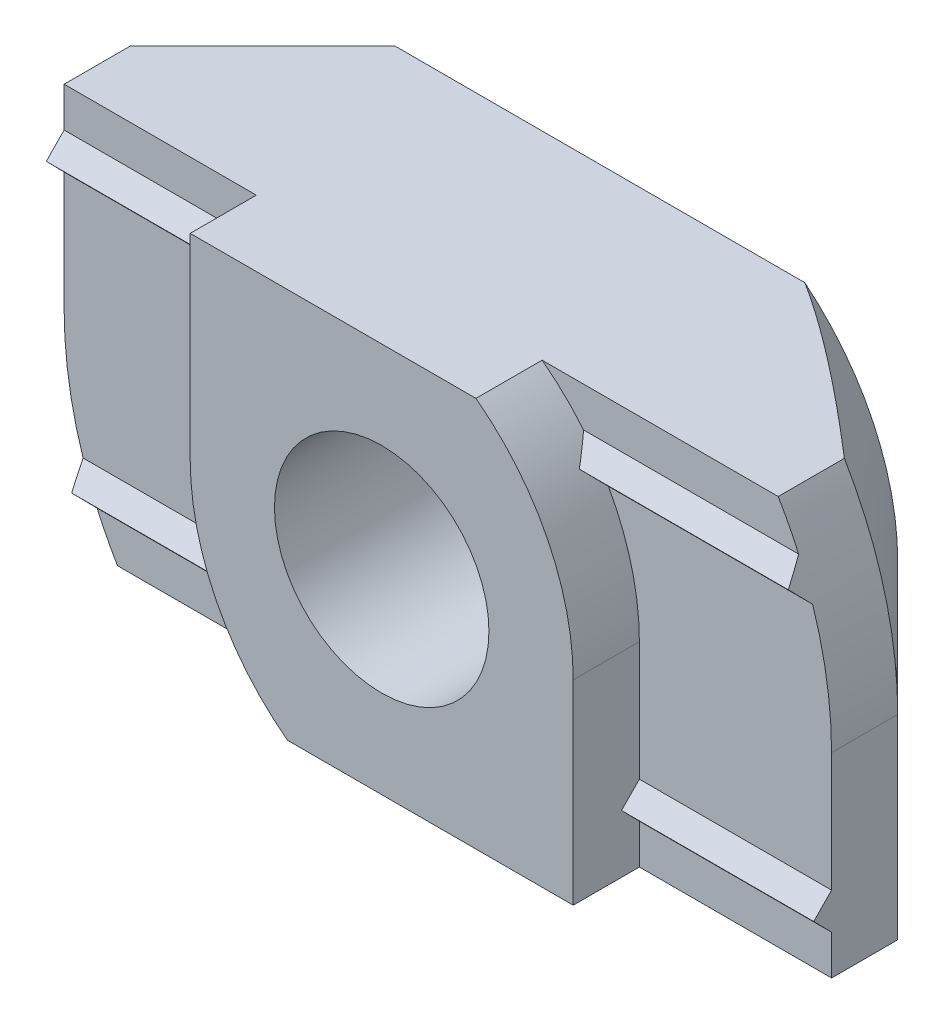
ISO-10303-21;
HEADER;
FILE_DESCRIPTION(('STEP AP214'),'2;1');
FILE_NAME('part.step','',(''),(''),'','','');
FILE_SCHEMA(('AUTOMOTIVE_DESIGN { 1 0 10303 214 1 1 1 1 }'));
ENDSEC;
DATA;
#1=APPLICATION_CONTEXT('core data for automotive mechanical design processes');
#2=APPLICATION_PROTOCOL_DEFINITION('international standard','automotive_design',2000,#1);
#3=PRODUCT_CONTEXT('',#1,'mechanical');
#4=PRODUCT('Part','Part','',(#3));
#5=PRODUCT_RELATED_PRODUCT_CATEGORY('part','',(#4));
#6=PRODUCT_DEFINITION_FORMATION('','',#4);
#7=PRODUCT_DEFINITION_CONTEXT('part definition',#1,'design');
#8=PRODUCT_DEFINITION('design','',#6,#7);
#9=PRODUCT_DEFINITION_SHAPE('','',#8);
#10=(LENGTH_UNIT() NAMED_UNIT(*) SI_UNIT(.MILLI.,.METRE.));
#11=(NAMED_UNIT(*) PLANE_ANGLE_UNIT() SI_UNIT($,.RADIAN.));
#12=(NAMED_UNIT(*) SI_UNIT($,.STERADIAN.) SOLID_ANGLE_UNIT());
#13=UNCERTAINTY_MEASURE_WITH_UNIT(LENGTH_MEASURE(1.E-05),#10,'distance_accuracy_value','');
#14=(GEOMETRIC_REPRESENTATION_CONTEXT(3) GLOBAL_UNCERTAINTY_ASSIGNED_CONTEXT((#13)) GLOBAL_UNIT_ASSIGNED_CONTEXT((#10,
#11,#12)) REPRESENTATION_CONTEXT('',''));
#15=CARTESIAN_POINT('',(0.,0.,0.));
#16=DIRECTION('',(0.,0.,1.));
#17=DIRECTION('',(1.,0.,0.));
#18=AXIS2_PLACEMENT_3D('',#15,#16,#17);
#19=CARTESIAN_POINT('',(0.,-2.35,3.));
#20=DIRECTION('',(0.,-0.700590079998202,0.713563970368539));
#21=DIRECTION('',(0.,-0.713563970368539,-0.700590079998202));
#22=AXIS2_PLACEMENT_3D('',#19,#20,#21);
#23=PLANE('',#22);
#24=DIRECTION('',(0.,-0.71356397036854,-0.7005900799982));
#25=VECTOR('',#24,1.);
#26=CARTESIAN_POINT('',(5.8,-2.075,3.27));
#27=LINE('',#26,#25);
#28=CARTESIAN_POINT('',(5.8,-2.075,3.27));
#29=VERTEX_POINT('',#28);
#30=CARTESIAN_POINT('',(5.8,-2.35,3.));
#31=VERTEX_POINT('',#30);
#32=EDGE_CURVE('E277',#29,#31,#27,.T.);
#33=ORIENTED_EDGE('',*,*,#32,.F.);
#34=DIRECTION('',(1.,0.,0.));
#35=VECTOR('',#34,1.);
#36=CARTESIAN_POINT('',(0.,-2.075,3.27));
#37=LINE('',#36,#35);
#38=CARTESIAN_POINT('',(2.895,-2.075,3.27));
#39=VERTEX_POINT('',#38);
#40=EDGE_CURVE('E264',#39,#29,#37,.T.);
#41=ORIENTED_EDGE('',*,*,#40,.F.);
#42=DIRECTION('',(0.,-0.713563970368539,-0.700590079998202));
#43=VECTOR('',#42,1.);
#44=CARTESIAN_POINT('',(2.895,-2.35,3.));
#45=LINE('',#44,#43);
#46=CARTESIAN_POINT('',(2.895,-2.35,3.));
#47=VERTEX_POINT('',#46);
#48=EDGE_CURVE('E205',#39,#47,#45,.T.);
#49=ORIENTED_EDGE('',*,*,#48,.T.);
#50=DIRECTION('',(1.,0.,0.));
#51=VECTOR('',#50,1.);
#52=CARTESIAN_POINT('',(0.,-2.35,3.));
#53=LINE('',#52,#51);
#54=EDGE_CURVE('E282',#31,#47,#53,.F.);
#55=ORIENTED_EDGE('',*,*,#54,.F.);
#56=EDGE_LOOP('',(#33,#41,#49,#55));
#57=FACE_BOUND('',#56,.T.);
#58=ADVANCED_FACE('F17',(#57),#23,.T.);
#59=CARTESIAN_POINT('',(0.,-2.35,3.));
#60=DIRECTION('',(0.,-0.700590079998202,0.713563970368539));
#61=DIRECTION('',(0.,-0.713563970368539,-0.700590079998202));
#62=AXIS2_PLACEMENT_3D('',#59,#60,#61);
#63=PLANE('',#62);
#64=CARTESIAN_POINT('',(0.8,0.,5.30727272727273));
#65=DIRECTION('',(0.,-0.700590079998202,0.713563970368539));
#66=DIRECTION('',(0.,-0.713563970368539,-0.700590079998202));
#67=AXIS2_PLACEMENT_3D('',#64,#65,#66);
#68=ELLIPSE('',#67,5.17823230073068,3.695);
#69=CARTESIAN_POINT('',(-2.05140754715982,-2.35,3.));
#70=VERTEX_POINT('',#69);
#71=CARTESIAN_POINT('',(-2.25735179526335,-2.075,3.27));
#72=VERTEX_POINT('',#71);
#73=EDGE_CURVE('E20',#70,#72,#68,.F.);
#74=ORIENTED_EDGE('',*,*,#73,.T.);
#75=DIRECTION('',(1.,0.,0.));
#76=VECTOR('',#75,1.);
#77=CARTESIAN_POINT('',(0.,-2.075,3.27));
#78=LINE('',#77,#76);
#79=CARTESIAN_POINT('',(-5.41612176746424,-2.075,3.27));
#80=VERTEX_POINT('',#79);
#81=EDGE_CURVE('E257',#80,#72,#78,.T.);
#82=ORIENTED_EDGE('',*,*,#81,.F.);
#83=CARTESIAN_POINT('',(0.,0.,5.30727272727273));
#84=DIRECTION('',(0.,-0.700590079998202,0.713563970368539));
#85=DIRECTION('',(0.,0.713563970368539,0.700590079998202));
#86=AXIS2_PLACEMENT_3D('',#83,#84,#85);
#87=ELLIPSE('',#86,8.12821308369092,5.8);
#88=CARTESIAN_POINT('',(-5.30259370497118,-2.35,3.));
#89=VERTEX_POINT('',#88);
#90=EDGE_CURVE('E209',#89,#80,#87,.F.);
#91=ORIENTED_EDGE('',*,*,#90,.F.);
#92=DIRECTION('',(1.,0.,0.));
#93=VECTOR('',#92,1.);
#94=CARTESIAN_POINT('',(0.,-2.35,3.));
#95=LINE('',#94,#93);
#96=EDGE_CURVE('E207',#70,#89,#95,.F.);
#97=ORIENTED_EDGE('',*,*,#96,.F.);
#98=EDGE_LOOP('',(#74,#82,#91,#97));
#99=FACE_BOUND('',#98,.T.);
#100=ADVANCED_FACE('F208',(#99),#63,.T.);
#101=CARTESIAN_POINT('',(0.,2.075,3.27));
#102=DIRECTION('',(0.,0.700590079998202,-0.713563970368539));
#103=DIRECTION('',(0.,0.713563970368539,0.700590079998202));
#104=AXIS2_PLACEMENT_3D('',#101,#102,#103);
#105=PLANE('',#104);
#106=DIRECTION('',(1.,0.,0.));
#107=VECTOR('',#106,1.);
#108=CARTESIAN_POINT('',(0.,2.075,3.27));
#109=LINE('',#108,#107);
#110=CARTESIAN_POINT('',(5.41612176746424,2.075,3.27));
#111=VERTEX_POINT('',#110);
#112=CARTESIAN_POINT('',(2.25735179526335,2.075,3.27));
#113=VERTEX_POINT('',#112);
#114=EDGE_CURVE('E259',#111,#113,#109,.F.);
#115=ORIENTED_EDGE('',*,*,#114,.T.);
#116=CARTESIAN_POINT('',(-0.8,0.,1.23272727272727));
#117=DIRECTION('',(0.,0.700590079998202,-0.713563970368539));
#118=DIRECTION('',(0.,-0.713563970368539,-0.700590079998202));
#119=AXIS2_PLACEMENT_3D('',#116,#117,#118);
#120=ELLIPSE('',#119,5.17823230073068,3.695);
#121=CARTESIAN_POINT('',(2.42692190794881,1.8,3.));
#122=VERTEX_POINT('',#121);
#123=EDGE_CURVE('E204',#122,#113,#120,.F.);
#124=ORIENTED_EDGE('',*,*,#123,.F.);
#125=DIRECTION('',(1.,0.,0.));
#126=VECTOR('',#125,1.);
#127=CARTESIAN_POINT('',(0.,1.8,3.));
#128=LINE('',#127,#126);
#129=CARTESIAN_POINT('',(5.51361950083609,1.8,3.));
#130=VERTEX_POINT('',#129);
#131=EDGE_CURVE('E240',#130,#122,#128,.F.);
#132=ORIENTED_EDGE('',*,*,#131,.F.);
#133=CARTESIAN_POINT('',(0.,0.,1.23272727272727));
#134=DIRECTION('',(0.,0.700590079998202,-0.713563970368539));
#135=DIRECTION('',(0.,0.713563970368539,0.700590079998202));
#136=AXIS2_PLACEMENT_3D('',#133,#134,#135);
#137=ELLIPSE('',#136,8.12821308369092,5.8);
#138=EDGE_CURVE('E243',#111,#130,#137,.T.);
#139=ORIENTED_EDGE('',*,*,#138,.F.);
#140=EDGE_LOOP('',(#115,#124,#132,#139));
#141=FACE_BOUND('',#140,.T.);
#142=ADVANCED_FACE('F593',(#141),#105,.F.);
#143=CARTESIAN_POINT('',(0.,-2.075,3.27));
#144=DIRECTION('',(0.,0.700590079998202,0.713563970368539));
#145=DIRECTION('',(0.,-0.713563970368539,0.700590079998202));
#146=AXIS2_PLACEMENT_3D('',#143,#144,#145);
#147=PLANE('',#146);
#148=DIRECTION('',(0.,-0.713563970368538,0.700590079998203));
#149=VECTOR('',#148,1.);
#150=CARTESIAN_POINT('',(5.8,-1.8,3.));
#151=LINE('',#150,#149);
#152=CARTESIAN_POINT('',(5.8,-1.8,3.));
#153=VERTEX_POINT('',#152);
#154=EDGE_CURVE('E252',#153,#29,#151,.T.);
#155=ORIENTED_EDGE('',*,*,#154,.F.);
#156=DIRECTION('',(1.,0.,0.));
#157=VECTOR('',#156,1.);
#158=CARTESIAN_POINT('',(0.,-1.8,3.));
#159=LINE('',#158,#157);
#160=CARTESIAN_POINT('',(2.895,-1.8,3.));
#161=VERTEX_POINT('',#160);
#162=EDGE_CURVE('E480',#161,#153,#159,.T.);
#163=ORIENTED_EDGE('',*,*,#162,.F.);
#164=DIRECTION('',(0.,-0.713563970368539,0.700590079998202));
#165=VECTOR('',#164,1.);
#166=CARTESIAN_POINT('',(2.895,-2.075,3.27));
#167=LINE('',#166,#165);
#168=EDGE_CURVE('E260',#161,#39,#167,.T.);
#169=ORIENTED_EDGE('',*,*,#168,.T.);
#170=ORIENTED_EDGE('',*,*,#40,.T.);
#171=EDGE_LOOP('',(#155,#163,#169,#170));
#172=FACE_BOUND('',#171,.T.);
#173=ADVANCED_FACE('F590',(#172),#147,.T.);
#174=CARTESIAN_POINT('',(0.,2.35,3.));
#175=DIRECTION('',(0.,-0.700590079998202,-0.713563970368539));
#176=DIRECTION('',(0.,0.713563970368539,-0.700590079998202));
#177=AXIS2_PLACEMENT_3D('',#174,#175,#176);
#178=PLANE('',#177);
#179=DIRECTION('',(1.,0.,0.));
#180=VECTOR('',#179,1.);
#181=CARTESIAN_POINT('',(0.,2.35,3.));
#182=LINE('',#181,#180);
#183=CARTESIAN_POINT('',(-5.8,2.35,3.));
#184=VERTEX_POINT('',#183);
#185=CARTESIAN_POINT('',(-2.895,2.35,3.));
#186=VERTEX_POINT('',#185);
#187=EDGE_CURVE('E462',#184,#186,#182,.T.);
#188=ORIENTED_EDGE('',*,*,#187,.F.);
#189=DIRECTION('',(0.,0.71356397036854,-0.7005900799982));
#190=VECTOR('',#189,1.);
#191=CARTESIAN_POINT('',(-5.8,2.075,3.27));
#192=LINE('',#191,#190);
#193=CARTESIAN_POINT('',(-5.8,2.075,3.27));
#194=VERTEX_POINT('',#193);
#195=EDGE_CURVE('E525',#194,#184,#192,.T.);
#196=ORIENTED_EDGE('',*,*,#195,.F.);
#197=DIRECTION('',(1.,0.,0.));
#198=VECTOR('',#197,1.);
#199=CARTESIAN_POINT('',(0.,2.075,3.27));
#200=LINE('',#199,#198);
#201=CARTESIAN_POINT('',(-2.895,2.075,3.27));
#202=VERTEX_POINT('',#201);
#203=EDGE_CURVE('E256',#194,#202,#200,.T.);
#204=ORIENTED_EDGE('',*,*,#203,.T.);
#205=DIRECTION('',(0.,0.713563970368539,-0.700590079998202));
#206=VECTOR('',#205,1.);
#207=CARTESIAN_POINT('',(-2.895,2.35,3.));
#208=LINE('',#207,#206);
#209=EDGE_CURVE('E269',#186,#202,#208,.F.);
#210=ORIENTED_EDGE('',*,*,#209,.F.);
#211=EDGE_LOOP('',(#188,#196,#204,#210));
#212=FACE_BOUND('',#211,.T.);
#213=ADVANCED_FACE('F592',(#212),#178,.F.);
#214=CARTESIAN_POINT('',(0.,2.35,3.));
#215=DIRECTION('',(0.,-0.700590079998202,-0.713563970368539));
#216=DIRECTION('',(0.,0.713563970368539,-0.700590079998202));
#217=AXIS2_PLACEMENT_3D('',#214,#215,#216);
#218=PLANE('',#217);
#219=DIRECTION('',(1.,0.,0.));
#220=VECTOR('',#219,1.);
#221=CARTESIAN_POINT('',(0.,2.35,3.));
#222=LINE('',#221,#220);
#223=CARTESIAN_POINT('',(2.05140754715982,2.35,3.));
#224=VERTEX_POINT('',#223);
#225=CARTESIAN_POINT('',(5.30259370497118,2.35,3.));
#226=VERTEX_POINT('',#225);
#227=EDGE_CURVE('E233',#224,#226,#222,.T.);
#228=ORIENTED_EDGE('',*,*,#227,.F.);
#229=CARTESIAN_POINT('',(-0.8,0.,5.30727272727273));
#230=DIRECTION('',(0.,-0.700590079998202,-0.713563970368539));
#231=DIRECTION('',(0.,0.713563970368539,-0.700590079998202));
#232=AXIS2_PLACEMENT_3D('',#229,#230,#231);
#233=ELLIPSE('',#232,5.17823230073068,3.695);
#234=EDGE_CURVE('E258',#113,#224,#233,.F.);
#235=ORIENTED_EDGE('',*,*,#234,.F.);
#236=ORIENTED_EDGE('',*,*,#114,.F.);
#237=CARTESIAN_POINT('',(0.,0.,5.30727272727273));
#238=DIRECTION('',(0.,-0.700590079998202,-0.713563970368539));
#239=DIRECTION('',(0.,-0.713563970368539,0.700590079998202));
#240=AXIS2_PLACEMENT_3D('',#237,#238,#239);
#241=ELLIPSE('',#240,8.12821308369092,5.8);
#242=EDGE_CURVE('E246',#226,#111,#241,.T.);
#243=ORIENTED_EDGE('',*,*,#242,.F.);
#244=EDGE_LOOP('',(#228,#235,#236,#243));
#245=FACE_BOUND('',#244,.T.);
#246=ADVANCED_FACE('F599',(#245),#218,.F.);
#247=CARTESIAN_POINT('',(0.,-2.075,3.27));
#248=DIRECTION('',(0.,0.700590079998202,0.713563970368539));
#249=DIRECTION('',(0.,-0.713563970368539,0.700590079998202));
#250=AXIS2_PLACEMENT_3D('',#247,#248,#249);
#251=PLANE('',#250);
#252=CARTESIAN_POINT('',(0.8,0.,1.23272727272727));
#253=DIRECTION('',(0.,0.700590079998202,0.713563970368539));
#254=DIRECTION('',(0.,0.713563970368539,-0.700590079998202));
#255=AXIS2_PLACEMENT_3D('',#252,#253,#254);
#256=ELLIPSE('',#255,5.17823230073068,3.695);
#257=CARTESIAN_POINT('',(-2.42692190794881,-1.8,3.));
#258=VERTEX_POINT('',#257);
#259=EDGE_CURVE('E200',#72,#258,#256,.F.);
#260=ORIENTED_EDGE('',*,*,#259,.T.);
#261=DIRECTION('',(1.,0.,0.));
#262=VECTOR('',#261,1.);
#263=CARTESIAN_POINT('',(0.,-1.8,3.));
#264=LINE('',#263,#262);
#265=CARTESIAN_POINT('',(-5.51361950083609,-1.8,3.));
#266=VERTEX_POINT('',#265);
#267=EDGE_CURVE('E232',#266,#258,#264,.T.);
#268=ORIENTED_EDGE('',*,*,#267,.F.);
#269=CARTESIAN_POINT('',(0.,0.,1.23272727272727));
#270=DIRECTION('',(0.,0.700590079998202,0.713563970368539));
#271=DIRECTION('',(0.,-0.713563970368539,0.700590079998202));
#272=AXIS2_PLACEMENT_3D('',#269,#270,#271);
#273=ELLIPSE('',#272,8.12821308369092,5.8);
#274=EDGE_CURVE('E250',#80,#266,#273,.F.);
#275=ORIENTED_EDGE('',*,*,#274,.F.);
#276=ORIENTED_EDGE('',*,*,#81,.T.);
#277=EDGE_LOOP('',(#260,#268,#275,#276));
#278=FACE_BOUND('',#277,.T.);
#279=ADVANCED_FACE('F645',(#278),#251,.T.);
#280=CARTESIAN_POINT('',(0.,2.075,3.27));
#281=DIRECTION('',(0.,0.700590079998202,-0.713563970368539));
#282=DIRECTION('',(0.,0.713563970368539,0.700590079998202));
#283=AXIS2_PLACEMENT_3D('',#280,#281,#282);
#284=PLANE('',#283);
#285=ORIENTED_EDGE('',*,*,#203,.F.);
#286=DIRECTION('',(0.,0.713563970368538,0.700590079998203));
#287=VECTOR('',#286,1.);
#288=CARTESIAN_POINT('',(-5.8,1.8,3.));
#289=LINE('',#288,#287);
#290=CARTESIAN_POINT('',(-5.8,1.8,3.));
#291=VERTEX_POINT('',#290);
#292=EDGE_CURVE('E528',#291,#194,#289,.T.);
#293=ORIENTED_EDGE('',*,*,#292,.F.);
#294=DIRECTION('',(1.,0.,0.));
#295=VECTOR('',#294,1.);
#296=CARTESIAN_POINT('',(0.,1.8,3.));
#297=LINE('',#296,#295);
#298=CARTESIAN_POINT('',(-2.895,1.8,3.));
#299=VERTEX_POINT('',#298);
#300=EDGE_CURVE('E449',#299,#291,#297,.F.);
#301=ORIENTED_EDGE('',*,*,#300,.F.);
#302=DIRECTION('',(0.,0.713563970368539,0.700590079998202));
#303=VECTOR('',#302,1.);
#304=CARTESIAN_POINT('',(-2.895,2.075,3.27));
#305=LINE('',#304,#303);
#306=EDGE_CURVE('E295',#202,#299,#305,.F.);
#307=ORIENTED_EDGE('',*,*,#306,.F.);
#308=EDGE_LOOP('',(#285,#293,#301,#307));
#309=FACE_BOUND('',#308,.T.);
#310=ADVANCED_FACE('F654',(#309),#284,.F.);
#311=CARTESIAN_POINT('',(-5.8,-2.95,0.));
#312=DIRECTION('',(-1.,0.,0.));
#313=DIRECTION('',(0.,0.,1.));
#314=AXIS2_PLACEMENT_3D('',#311,#312,#313);
#315=PLANE('',#314);
#316=DIRECTION('',(0.,0.,1.));
#317=VECTOR('',#316,1.);
#318=CARTESIAN_POINT('',(-5.8,2.95,0.));
#319=LINE('',#318,#317);
#320=CARTESIAN_POINT('',(-5.8,2.95,3.));
#321=VERTEX_POINT('',#320);
#322=CARTESIAN_POINT('',(-5.8,2.95,2.));
#323=VERTEX_POINT('',#322);
#324=EDGE_CURVE('E521',#321,#323,#319,.F.);
#325=ORIENTED_EDGE('',*,*,#324,.T.);
#326=DIRECTION('',(0.,1.,0.));
#327=VECTOR('',#326,1.);
#328=CARTESIAN_POINT('',(-5.8,-1.475,2.));
#329=LINE('',#328,#327);
#330=CARTESIAN_POINT('',(-5.79999999998258,0.,1.99999999997635));
#331=VERTEX_POINT('',#330);
#332=EDGE_CURVE('E448',#331,#323,#329,.T.);
#333=ORIENTED_EDGE('',*,*,#332,.F.);
#334=DIRECTION('',(0.,0.,1.));
#335=VECTOR('',#334,1.);
#336=CARTESIAN_POINT('',(-5.8,0.,2.5));
#337=LINE('',#336,#335);
#338=CARTESIAN_POINT('',(-5.8,0.,3.));
#339=VERTEX_POINT('',#338);
#340=EDGE_CURVE('E519',#339,#331,#337,.F.);
#341=ORIENTED_EDGE('',*,*,#340,.F.);
#342=DIRECTION('',(0.,1.,0.));
#343=VECTOR('',#342,1.);
#344=CARTESIAN_POINT('',(-5.8,0.,3.));
#345=LINE('',#344,#343);
#346=EDGE_CURVE('E445',#291,#339,#345,.F.);
#347=ORIENTED_EDGE('',*,*,#346,.F.);
#348=ORIENTED_EDGE('',*,*,#292,.T.);
#349=ORIENTED_EDGE('',*,*,#195,.T.);
#350=DIRECTION('',(0.,1.,0.));
#351=VECTOR('',#350,1.);
#352=CARTESIAN_POINT('',(-5.8,0.,3.));
#353=LINE('',#352,#351);
#354=EDGE_CURVE('E237',#321,#184,#353,.F.);
#355=ORIENTED_EDGE('',*,*,#354,.F.);
#356=EDGE_LOOP('',(#325,#333,#341,#347,#348,#349,#355));
#357=FACE_BOUND('',#356,.T.);
#358=ADVANCED_FACE('F664',(#357),#315,.T.);
#359=CARTESIAN_POINT('',(0.,0.,2.5));
#360=DIRECTION('',(0.,0.,1.));
#361=DIRECTION('',(1.,0.,0.));
#362=AXIS2_PLACEMENT_3D('',#359,#360,#361);
#363=CYLINDRICAL_SURFACE('',#362,5.8);
#364=ORIENTED_EDGE('',*,*,#90,.T.);
#365=ORIENTED_EDGE('',*,*,#274,.T.);
#366=CARTESIAN_POINT('',(0.,0.,3.));
#367=DIRECTION('',(0.,0.,1.));
#368=DIRECTION('',(1.,0.,0.));
#369=AXIS2_PLACEMENT_3D('',#366,#367,#368);
#370=CIRCLE('',#369,5.8);
#371=EDGE_CURVE('E229',#339,#266,#370,.T.);
#372=ORIENTED_EDGE('',*,*,#371,.F.);
#373=ORIENTED_EDGE('',*,*,#340,.T.);
#374=CARTESIAN_POINT('',(0.,0.,1.99999999995271));
#375=DIRECTION('',(0.,0.,1.));
#376=DIRECTION('',(-1.,0.,0.));
#377=AXIS2_PLACEMENT_3D('',#374,#375,#376);
#378=CIRCLE('',#377,5.79999999996517);
#379=CARTESIAN_POINT('',(-4.99374608883931,-2.95,1.99999999997012));
#380=VERTEX_POINT('',#379);
#381=EDGE_CURVE('E432',#380,#331,#378,.F.);
#382=ORIENTED_EDGE('',*,*,#381,.F.);
#383=DIRECTION('',(0.,0.,1.));
#384=VECTOR('',#383,1.);
#385=CARTESIAN_POINT('',(-4.99374608885954,-2.95,2.5));
#386=LINE('',#385,#384);
#387=CARTESIAN_POINT('',(-4.99374608885954,-2.95,3.));
#388=VERTEX_POINT('',#387);
#389=EDGE_CURVE('E254',#380,#388,#386,.T.);
#390=ORIENTED_EDGE('',*,*,#389,.T.);
#391=CARTESIAN_POINT('',(0.,0.,3.));
#392=DIRECTION('',(0.,0.,1.));
#393=DIRECTION('',(1.,0.,0.));
#394=AXIS2_PLACEMENT_3D('',#391,#392,#393);
#395=CIRCLE('',#394,5.8);
#396=EDGE_CURVE('E214',#89,#388,#395,.T.);
#397=ORIENTED_EDGE('',*,*,#396,.F.);
#398=EDGE_LOOP('',(#364,#365,#372,#373,#382,#390,#397));
#399=FACE_BOUND('',#398,.T.);
#400=ADVANCED_FACE('F674',(#399),#363,.T.);
#401=CARTESIAN_POINT('',(5.8,2.95,0.));
#402=DIRECTION('',(1.,0.,0.));
#403=DIRECTION('',(0.,0.,-1.));
#404=AXIS2_PLACEMENT_3D('',#401,#402,#403);
#405=PLANE('',#404);
#406=DIRECTION('',(0.,0.,-1.));
#407=VECTOR('',#406,1.);
#408=CARTESIAN_POINT('',(5.8,-2.95,0.));
#409=LINE('',#408,#407);
#410=CARTESIAN_POINT('',(5.8,-2.95,3.));
#411=VERTEX_POINT('',#410);
#412=CARTESIAN_POINT('',(5.8,-2.95,2.));
#413=VERTEX_POINT('',#412);
#414=EDGE_CURVE('E279',#411,#413,#409,.T.);
#415=ORIENTED_EDGE('',*,*,#414,.T.);
#416=DIRECTION('',(0.,1.,0.));
#417=VECTOR('',#416,1.);
#418=CARTESIAN_POINT('',(5.8,1.475,2.));
#419=LINE('',#418,#417);
#420=CARTESIAN_POINT('',(5.79999999998258,0.,1.99999999997635));
#421=VERTEX_POINT('',#420);
#422=EDGE_CURVE('E431',#421,#413,#419,.F.);
#423=ORIENTED_EDGE('',*,*,#422,.F.);
#424=DIRECTION('',(0.,0.,1.));
#425=VECTOR('',#424,1.);
#426=CARTESIAN_POINT('',(5.8,0.,2.5));
#427=LINE('',#426,#425);
#428=CARTESIAN_POINT('',(5.8,0.,3.));
#429=VERTEX_POINT('',#428);
#430=EDGE_CURVE('E245',#429,#421,#427,.F.);
#431=ORIENTED_EDGE('',*,*,#430,.F.);
#432=DIRECTION('',(0.,1.,0.));
#433=VECTOR('',#432,1.);
#434=CARTESIAN_POINT('',(5.8,0.,3.));
#435=LINE('',#434,#433);
#436=EDGE_CURVE('E477',#153,#429,#435,.T.);
#437=ORIENTED_EDGE('',*,*,#436,.F.);
#438=ORIENTED_EDGE('',*,*,#154,.T.);
#439=ORIENTED_EDGE('',*,*,#32,.T.);
#440=DIRECTION('',(0.,1.,0.));
#441=VECTOR('',#440,1.);
#442=CARTESIAN_POINT('',(5.8,0.,3.));
#443=LINE('',#442,#441);
#444=EDGE_CURVE('E242',#411,#31,#443,.T.);
#445=ORIENTED_EDGE('',*,*,#444,.F.);
#446=EDGE_LOOP('',(#415,#423,#431,#437,#438,#439,#445));
#447=FACE_BOUND('',#446,.T.);
#448=ADVANCED_FACE('F553',(#447),#405,.T.);
#449=CARTESIAN_POINT('',(0.,0.,2.5));
#450=DIRECTION('',(0.,0.,1.));
#451=DIRECTION('',(1.,0.,0.));
#452=AXIS2_PLACEMENT_3D('',#449,#450,#451);
#453=CYLINDRICAL_SURFACE('',#452,5.8);
#454=ORIENTED_EDGE('',*,*,#430,.T.);
#455=CARTESIAN_POINT('',(0.,0.,1.99999999995271));
#456=DIRECTION('',(0.,0.,1.));
#457=DIRECTION('',(1.,0.,0.));
#458=AXIS2_PLACEMENT_3D('',#455,#456,#457);
#459=CIRCLE('',#458,5.79999999996517);
#460=CARTESIAN_POINT('',(4.99374608883931,2.95,1.99999999997012));
#461=VERTEX_POINT('',#460);
#462=EDGE_CURVE('E225',#461,#421,#459,.F.);
#463=ORIENTED_EDGE('',*,*,#462,.F.);
#464=DIRECTION('',(0.,0.,1.));
#465=VECTOR('',#464,1.);
#466=CARTESIAN_POINT('',(4.99374608885954,2.95,2.5));
#467=LINE('',#466,#465);
#468=CARTESIAN_POINT('',(4.99374608885954,2.95,3.));
#469=VERTEX_POINT('',#468);
#470=EDGE_CURVE('E249',#461,#469,#467,.T.);
#471=ORIENTED_EDGE('',*,*,#470,.T.);
#472=CARTESIAN_POINT('',(0.,0.,3.));
#473=DIRECTION('',(0.,0.,1.));
#474=DIRECTION('',(1.,0.,0.));
#475=AXIS2_PLACEMENT_3D('',#472,#473,#474);
#476=CIRCLE('',#475,5.8);
#477=EDGE_CURVE('E234',#226,#469,#476,.T.);
#478=ORIENTED_EDGE('',*,*,#477,.F.);
#479=ORIENTED_EDGE('',*,*,#242,.T.);
#480=ORIENTED_EDGE('',*,*,#138,.T.);
#481=CARTESIAN_POINT('',(0.,0.,3.));
#482=DIRECTION('',(0.,0.,1.));
#483=DIRECTION('',(1.,0.,0.));
#484=AXIS2_PLACEMENT_3D('',#481,#482,#483);
#485=CIRCLE('',#484,5.8);
#486=EDGE_CURVE('E213',#429,#130,#485,.T.);
#487=ORIENTED_EDGE('',*,*,#486,.F.);
#488=EDGE_LOOP('',(#454,#463,#471,#478,#479,#480,#487));
#489=FACE_BOUND('',#488,.T.);
#490=ADVANCED_FACE('F583',(#489),#453,.T.);
#491=CARTESIAN_POINT('',(0.,0.,3.));
#492=DIRECTION('',(0.,0.,1.));
#493=DIRECTION('',(1.,0.,0.));
#494=AXIS2_PLACEMENT_3D('',#491,#492,#493);
#495=PLANE('',#494);
#496=DIRECTION('',(1.,0.,0.));
#497=VECTOR('',#496,1.);
#498=CARTESIAN_POINT('',(5.8,-2.95,3.));
#499=LINE('',#498,#497);
#500=CARTESIAN_POINT('',(2.895,-2.95,3.));
#501=VERTEX_POINT('',#500);
#502=EDGE_CURVE('E421',#411,#501,#499,.F.);
#503=ORIENTED_EDGE('',*,*,#502,.F.);
#504=ORIENTED_EDGE('',*,*,#444,.T.);
#505=ORIENTED_EDGE('',*,*,#54,.T.);
#506=DIRECTION('',(0.,1.,0.));
#507=VECTOR('',#506,1.);
#508=CARTESIAN_POINT('',(2.895,0.,3.));
#509=LINE('',#508,#507);
#510=EDGE_CURVE('E285',#47,#501,#509,.F.);
#511=ORIENTED_EDGE('',*,*,#510,.T.);
#512=EDGE_LOOP('',(#503,#504,#505,#511));
#513=FACE_BOUND('',#512,.T.);
#514=ADVANCED_FACE('F561',(#513),#495,.T.);
#515=CARTESIAN_POINT('',(0.,0.,3.));
#516=DIRECTION('',(0.,0.,1.));
#517=DIRECTION('',(1.,0.,0.));
#518=AXIS2_PLACEMENT_3D('',#515,#516,#517);
#519=PLANE('',#518);
#520=CARTESIAN_POINT('',(0.8,0.,3.));
#521=DIRECTION('',(0.,0.,-1.));
#522=DIRECTION('',(-1.,0.,0.));
#523=AXIS2_PLACEMENT_3D('',#520,#521,#522);
#524=CIRCLE('',#523,3.695);
#525=CARTESIAN_POINT('',(-1.42497752797641,-2.95,3.));
#526=VERTEX_POINT('',#525);
#527=EDGE_CURVE('E198',#70,#526,#524,.F.);
#528=ORIENTED_EDGE('',*,*,#527,.F.);
#529=ORIENTED_EDGE('',*,*,#96,.T.);
#530=ORIENTED_EDGE('',*,*,#396,.T.);
#531=DIRECTION('',(1.,0.,0.));
#532=VECTOR('',#531,1.);
#533=CARTESIAN_POINT('',(5.8,-2.95,3.));
#534=LINE('',#533,#532);
#535=EDGE_CURVE('E219',#526,#388,#534,.F.);
#536=ORIENTED_EDGE('',*,*,#535,.F.);
#537=EDGE_LOOP('',(#528,#529,#530,#536));
#538=FACE_BOUND('',#537,.T.);
#539=ADVANCED_FACE('F217',(#538),#519,.T.);
#540=CARTESIAN_POINT('',(0.,0.,3.));
#541=DIRECTION('',(0.,0.,1.));
#542=DIRECTION('',(1.,0.,0.));
#543=AXIS2_PLACEMENT_3D('',#540,#541,#542);
#544=PLANE('',#543);
#545=ORIENTED_EDGE('',*,*,#162,.T.);
#546=ORIENTED_EDGE('',*,*,#436,.T.);
#547=ORIENTED_EDGE('',*,*,#486,.T.);
#548=ORIENTED_EDGE('',*,*,#131,.T.);
#549=CARTESIAN_POINT('',(-0.8,0.,3.));
#550=DIRECTION('',(0.,0.,-1.));
#551=DIRECTION('',(-1.,0.,0.));
#552=AXIS2_PLACEMENT_3D('',#549,#550,#551);
#553=CIRCLE('',#552,3.695);
#554=CARTESIAN_POINT('',(2.895,0.,3.));
#555=VERTEX_POINT('',#554);
#556=EDGE_CURVE('E324',#555,#122,#553,.F.);
#557=ORIENTED_EDGE('',*,*,#556,.F.);
#558=DIRECTION('',(0.,1.,0.));
#559=VECTOR('',#558,1.);
#560=CARTESIAN_POINT('',(2.895,2.95,3.));
#561=LINE('',#560,#559);
#562=EDGE_CURVE('E417',#161,#555,#561,.T.);
#563=ORIENTED_EDGE('',*,*,#562,.F.);
#564=EDGE_LOOP('',(#545,#546,#547,#548,#557,#563));
#565=FACE_BOUND('',#564,.T.);
#566=ADVANCED_FACE('F586',(#565),#544,.T.);
#567=CARTESIAN_POINT('',(0.,0.,3.));
#568=DIRECTION('',(0.,0.,1.));
#569=DIRECTION('',(1.,0.,0.));
#570=AXIS2_PLACEMENT_3D('',#567,#568,#569);
#571=PLANE('',#570);
#572=DIRECTION('',(1.,0.,0.));
#573=VECTOR('',#572,1.);
#574=CARTESIAN_POINT('',(-5.8,2.95,3.));
#575=LINE('',#574,#573);
#576=CARTESIAN_POINT('',(-2.895,2.95,3.));
#577=VERTEX_POINT('',#576);
#578=EDGE_CURVE('E410',#321,#577,#575,.T.);
#579=ORIENTED_EDGE('',*,*,#578,.F.);
#580=ORIENTED_EDGE('',*,*,#354,.T.);
#581=ORIENTED_EDGE('',*,*,#187,.T.);
#582=DIRECTION('',(0.,1.,0.));
#583=VECTOR('',#582,1.);
#584=CARTESIAN_POINT('',(-2.895,0.,3.));
#585=LINE('',#584,#583);
#586=EDGE_CURVE('E393',#186,#577,#585,.T.);
#587=ORIENTED_EDGE('',*,*,#586,.T.);
#588=EDGE_LOOP('',(#579,#580,#581,#587));
#589=FACE_BOUND('',#588,.T.);
#590=ADVANCED_FACE('F725',(#589),#571,.T.);
#591=CARTESIAN_POINT('',(0.,0.,3.));
#592=DIRECTION('',(0.,0.,1.));
#593=DIRECTION('',(1.,0.,0.));
#594=AXIS2_PLACEMENT_3D('',#591,#592,#593);
#595=PLANE('',#594);
#596=CARTESIAN_POINT('',(-0.8,0.,3.));
#597=DIRECTION('',(0.,0.,-1.));
#598=DIRECTION('',(-1.,0.,0.));
#599=AXIS2_PLACEMENT_3D('',#596,#597,#598);
#600=CIRCLE('',#599,3.695);
#601=CARTESIAN_POINT('',(1.42497752797641,2.95,3.));
#602=VERTEX_POINT('',#601);
#603=EDGE_CURVE('E352',#224,#602,#600,.F.);
#604=ORIENTED_EDGE('',*,*,#603,.F.);
#605=ORIENTED_EDGE('',*,*,#227,.T.);
#606=ORIENTED_EDGE('',*,*,#477,.T.);
#607=DIRECTION('',(1.,0.,0.));
#608=VECTOR('',#607,1.);
#609=CARTESIAN_POINT('',(-5.8,2.95,3.));
#610=LINE('',#609,#608);
#611=EDGE_CURVE('E409',#602,#469,#610,.T.);
#612=ORIENTED_EDGE('',*,*,#611,.F.);
#613=EDGE_LOOP('',(#604,#605,#606,#612));
#614=FACE_BOUND('',#613,.T.);
#615=ADVANCED_FACE('F734',(#614),#595,.T.);
#616=CARTESIAN_POINT('',(0.,0.,3.));
#617=DIRECTION('',(0.,0.,1.));
#618=DIRECTION('',(1.,0.,0.));
#619=AXIS2_PLACEMENT_3D('',#616,#617,#618);
#620=PLANE('',#619);
#621=ORIENTED_EDGE('',*,*,#300,.T.);
#622=ORIENTED_EDGE('',*,*,#346,.T.);
#623=ORIENTED_EDGE('',*,*,#371,.T.);
#624=ORIENTED_EDGE('',*,*,#267,.T.);
#625=CARTESIAN_POINT('',(0.8,0.,3.));
#626=DIRECTION('',(0.,0.,-1.));
#627=DIRECTION('',(-1.,0.,0.));
#628=AXIS2_PLACEMENT_3D('',#625,#626,#627);
#629=CIRCLE('',#628,3.695);
#630=CARTESIAN_POINT('',(-2.895,0.,3.));
#631=VERTEX_POINT('',#630);
#632=EDGE_CURVE('E220',#631,#258,#629,.F.);
#633=ORIENTED_EDGE('',*,*,#632,.F.);
#634=DIRECTION('',(0.,1.,0.));
#635=VECTOR('',#634,1.);
#636=CARTESIAN_POINT('',(-2.895,-2.95,3.));
#637=LINE('',#636,#635);
#638=EDGE_CURVE('E400',#299,#631,#637,.F.);
#639=ORIENTED_EDGE('',*,*,#638,.F.);
#640=EDGE_LOOP('',(#621,#622,#623,#624,#633,#639));
#641=FACE_BOUND('',#640,.T.);
#642=ADVANCED_FACE('F744',(#641),#620,.T.);
#643=CARTESIAN_POINT('',(-4.8,-1.475,1.));
#644=DIRECTION('',(-0.707106781186548,0.,-0.707106781186548));
#645=DIRECTION('',(-0.707106781186548,0.,0.707106781186548));
#646=AXIS2_PLACEMENT_3D('',#643,#644,#645);
#647=PLANE('',#646);
#648=DIRECTION('',(-0.707106781186548,0.,0.707106781186548));
#649=VECTOR('',#648,1.);
#650=CARTESIAN_POINT('',(-3.8,2.95,0.));
#651=LINE('',#650,#649);
#652=CARTESIAN_POINT('',(-3.8,2.95,0.));
#653=VERTEX_POINT('',#652);
#654=EDGE_CURVE('E323',#653,#323,#651,.T.);
#655=ORIENTED_EDGE('',*,*,#654,.F.);
#656=DIRECTION('',(0.,1.,0.));
#657=VECTOR('',#656,1.);
#658=CARTESIAN_POINT('',(-3.8,0.,0.));
#659=LINE('',#658,#657);
#660=CARTESIAN_POINT('',(-3.80000000000934,0.,4.26323473051715E-11));
#661=VERTEX_POINT('',#660);
#662=EDGE_CURVE('E315',#653,#661,#659,.F.);
#663=ORIENTED_EDGE('',*,*,#662,.T.);
#664=DIRECTION('',(0.707106781188352,0.,-0.707106781184743));
#665=VECTOR('',#664,1.);
#666=CARTESIAN_POINT('',(-499000.,0.,498996.199997453));
#667=LINE('',#666,#665);
#668=EDGE_CURVE('E429',#331,#661,#667,.T.);
#669=ORIENTED_EDGE('',*,*,#668,.F.);
#670=ORIENTED_EDGE('',*,*,#332,.T.);
#671=EDGE_LOOP('',(#655,#663,#669,#670));
#672=FACE_BOUND('',#671,.T.);
#673=ADVANCED_FACE('F345',(#672),#647,.T.);
#674=CARTESIAN_POINT('',(0.,0.,1.99999999995271));
#675=DIRECTION('',(0.,0.,1.));
#676=DIRECTION('',(1.,0.,0.));
#677=AXIS2_PLACEMENT_3D('',#674,#675,#676);
#678=CONICAL_SURFACE('',#677,5.79999999996517,0.785398163411659);
#679=ORIENTED_EDGE('',*,*,#668,.T.);
#680=CARTESIAN_POINT('',(0.,0.,5.6842985179939E-11));
#681=DIRECTION('',(0.,0.,1.));
#682=DIRECTION('',(1.,0.,0.));
#683=AXIS2_PLACEMENT_3D('',#680,#681,#682);
#684=CIRCLE('',#683,3.80000000001246);
#685=CARTESIAN_POINT('',(-2.39530791340369,-2.95,4.62720697051629E-11));
#686=VERTEX_POINT('',#685);
#687=EDGE_CURVE('E311',#661,#686,#684,.T.);
#688=ORIENTED_EDGE('',*,*,#687,.T.);
#689=CARTESIAN_POINT('',(-4.99374608885555,-2.95,1.9999999999841));
#690=CARTESIAN_POINT('',(-4.8901002661652,-2.95,1.91076680299503));
#691=CARTESIAN_POINT('',(-4.78610618313113,-2.95,1.821940402457));
#692=CARTESIAN_POINT('',(-4.57728524693673,-2.95,1.64526787565311));
#693=CARTESIAN_POINT('',(-4.4724583759132,-2.95,1.55742177051218));
#694=CARTESIAN_POINT('',(-4.15679183170382,-2.95,1.29582590139316));
#695=CARTESIAN_POINT('',(-3.94451007649472,-2.95,1.12379665108753));
#696=CARTESIAN_POINT('',(-3.62195756142022,-2.95,0.87083184374982));
#697=CARTESIAN_POINT('',(-3.51370544965239,-2.95,0.787322777769939));
#698=CARTESIAN_POINT('',(-3.29557817890632,-2.95,0.622468758738315));
#699=CARTESIAN_POINT('',(-3.18570317720384,-2.95,0.541123598092976));
#700=CARTESIAN_POINT('',(-2.96386149567486,-2.95,0.381032558993836));
#701=CARTESIAN_POINT('',(-2.85189245271344,-2.95,0.302289934163042));
#702=CARTESIAN_POINT('',(-2.62552302420372,-2.95,0.14830509673784));
#703=CARTESIAN_POINT('',(-2.51112182848349,-2.95,0.0730640780436031));
#704=CARTESIAN_POINT('',(-2.39530791338633,-2.95,3.53289139441929E-11));
#705=B_SPLINE_CURVE_WITH_KNOTS('',3,(#689,#690,#691,#692,#693,#694,#695,#696,#697,#698,#699,
#700,#701,#702,#703,#704),.UNSPECIFIED.,.F.,.F.,(4,2,2,2,2,2,2,4),(0.,0.410293777234583,
0.820596379109647,1.6401849631337,2.05032360712328,2.46042276164313,2.8710165804408,
3.28174938387375),.UNSPECIFIED.);
#706=EDGE_CURVE('E223',#380,#686,#705,.T.);
#707=ORIENTED_EDGE('',*,*,#706,.F.);
#708=ORIENTED_EDGE('',*,*,#381,.T.);
#709=EDGE_LOOP('',(#679,#688,#707,#708));
#710=FACE_BOUND('',#709,.T.);
#711=ADVANCED_FACE('F340',(#710),#678,.T.);
#712=CARTESIAN_POINT('',(4.8,1.475,1.));
#713=DIRECTION('',(0.707106781186548,0.,-0.707106781186548));
#714=DIRECTION('',(-0.707106781186548,0.,-0.707106781186548));
#715=AXIS2_PLACEMENT_3D('',#712,#713,#714);
#716=PLANE('',#715);
#717=DIRECTION('',(0.707106781186548,0.,0.707106781186548));
#718=VECTOR('',#717,1.);
#719=CARTESIAN_POINT('',(3.8,-2.95,0.));
#720=LINE('',#719,#718);
#721=CARTESIAN_POINT('',(3.8,-2.95,0.));
#722=VERTEX_POINT('',#721);
#723=EDGE_CURVE('E351',#722,#413,#720,.T.);
#724=ORIENTED_EDGE('',*,*,#723,.F.);
#725=DIRECTION('',(0.,1.,0.));
#726=VECTOR('',#725,1.);
#727=CARTESIAN_POINT('',(3.8,0.,0.));
#728=LINE('',#727,#726);
#729=CARTESIAN_POINT('',(3.80000000000934,0.,4.26323473051715E-11));
#730=VERTEX_POINT('',#729);
#731=EDGE_CURVE('E310',#722,#730,#728,.T.);
#732=ORIENTED_EDGE('',*,*,#731,.T.);
#733=DIRECTION('',(-0.707106781188352,0.,-0.707106781184743));
#734=VECTOR('',#733,1.);
#735=CARTESIAN_POINT('',(499000.,0.,498996.199997453));
#736=LINE('',#735,#734);
#737=EDGE_CURVE('E221',#421,#730,#736,.T.);
#738=ORIENTED_EDGE('',*,*,#737,.F.);
#739=ORIENTED_EDGE('',*,*,#422,.T.);
#740=EDGE_LOOP('',(#724,#732,#738,#739));
#741=FACE_BOUND('',#740,.T.);
#742=ADVANCED_FACE('F335',(#741),#716,.T.);
#743=CARTESIAN_POINT('',(0.,0.,1.99999999995271));
#744=DIRECTION('',(0.,0.,1.));
#745=DIRECTION('',(1.,0.,0.));
#746=AXIS2_PLACEMENT_3D('',#743,#744,#745);
#747=CONICAL_SURFACE('',#746,5.79999999996517,0.785398163411659);
#748=ORIENTED_EDGE('',*,*,#737,.T.);
#749=CARTESIAN_POINT('',(0.,0.,5.6842985179939E-11));
#750=DIRECTION('',(0.,0.,1.));
#751=DIRECTION('',(1.,0.,0.));
#752=AXIS2_PLACEMENT_3D('',#749,#750,#751);
#753=CIRCLE('',#752,3.80000000001246);
#754=CARTESIAN_POINT('',(2.39530791340369,2.95,4.62720697051629E-11));
#755=VERTEX_POINT('',#754);
#756=EDGE_CURVE('E307',#730,#755,#753,.T.);
#757=ORIENTED_EDGE('',*,*,#756,.T.);
#758=CARTESIAN_POINT('',(4.99374608885555,2.95,1.9999999999841));
#759=CARTESIAN_POINT('',(4.8901002661652,2.95,1.91076680299503));
#760=CARTESIAN_POINT('',(4.78610618313113,2.95,1.821940402457));
#761=CARTESIAN_POINT('',(4.57728524693673,2.95,1.64526787565311));
#762=CARTESIAN_POINT('',(4.4724583759132,2.95,1.55742177051218));
#763=CARTESIAN_POINT('',(4.15679183170382,2.95,1.29582590139316));
#764=CARTESIAN_POINT('',(3.94451007649472,2.95,1.12379665108753));
#765=CARTESIAN_POINT('',(3.62195756142022,2.95,0.87083184374982));
#766=CARTESIAN_POINT('',(3.51370544965239,2.95,0.787322777769939));
#767=CARTESIAN_POINT('',(3.29557817890632,2.95,0.622468758738315));
#768=CARTESIAN_POINT('',(3.18570317720384,2.95,0.541123598092976));
#769=CARTESIAN_POINT('',(2.96386149567486,2.95,0.381032558993836));
#770=CARTESIAN_POINT('',(2.85189245271344,2.95,0.302289934163042));
#771=CARTESIAN_POINT('',(2.62552302420372,2.95,0.14830509673784));
#772=CARTESIAN_POINT('',(2.51112182848349,2.95,0.0730640780436031));
#773=CARTESIAN_POINT('',(2.39530791338633,2.95,3.53289139441929E-11));
#774=B_SPLINE_CURVE_WITH_KNOTS('',3,(#758,#759,#760,#761,#762,#763,#764,#765,#766,#767,#768,
#769,#770,#771,#772,#773),.UNSPECIFIED.,.F.,.F.,(4,2,2,2,2,2,2,4),(0.,0.410293777234583,
0.820596379109647,1.6401849631337,2.05032360712328,2.46042276164313,2.8710165804408,
3.28174938387375),.UNSPECIFIED.);
#775=EDGE_CURVE('E316',#461,#755,#774,.T.);
#776=ORIENTED_EDGE('',*,*,#775,.F.);
#777=ORIENTED_EDGE('',*,*,#462,.T.);
#778=EDGE_LOOP('',(#748,#757,#776,#777));
#779=FACE_BOUND('',#778,.T.);
#780=ADVANCED_FACE('F330',(#779),#747,.T.);
#781=CARTESIAN_POINT('',(0.8,0.,4.));
#782=DIRECTION('',(0.,0.,-1.));
#783=DIRECTION('',(-1.,0.,0.));
#784=AXIS2_PLACEMENT_3D('',#781,#782,#783);
#785=CYLINDRICAL_SURFACE('',#784,3.695);
#786=ORIENTED_EDGE('',*,*,#632,.T.);
#787=ORIENTED_EDGE('',*,*,#259,.F.);
#788=ORIENTED_EDGE('',*,*,#73,.F.);
#789=ORIENTED_EDGE('',*,*,#527,.T.);
#790=DIRECTION('',(0.,0.,-1.));
#791=VECTOR('',#790,1.);
#792=CARTESIAN_POINT('',(-1.42497752797641,-2.95,0.));
#793=LINE('',#792,#791);
#794=CARTESIAN_POINT('',(-1.42497752797641,-2.95,4.));
#795=VERTEX_POINT('',#794);
#796=EDGE_CURVE('E420',#795,#526,#793,.T.);
#797=ORIENTED_EDGE('',*,*,#796,.F.);
#798=CARTESIAN_POINT('',(0.8,0.,4.));
#799=DIRECTION('',(0.,0.,-1.));
#800=DIRECTION('',(-1.,0.,0.));
#801=AXIS2_PLACEMENT_3D('',#798,#799,#800);
#802=CIRCLE('',#801,3.695);
#803=CARTESIAN_POINT('',(-2.895,0.,4.));
#804=VERTEX_POINT('',#803);
#805=EDGE_CURVE('E304',#804,#795,#802,.F.);
#806=ORIENTED_EDGE('',*,*,#805,.F.);
#807=DIRECTION('',(0.,0.,1.));
#808=VECTOR('',#807,1.);
#809=CARTESIAN_POINT('',(-2.895,0.,3.));
#810=LINE('',#809,#808);
#811=EDGE_CURVE('E396',#631,#804,#810,.T.);
#812=ORIENTED_EDGE('',*,*,#811,.F.);
#813=EDGE_LOOP('',(#786,#787,#788,#789,#797,#806,#812));
#814=FACE_BOUND('',#813,.T.);
#815=ADVANCED_FACE('F195',(#814),#785,.T.);
#816=CARTESIAN_POINT('',(5.8,-2.95,0.));
#817=DIRECTION('',(0.,-1.,0.));
#818=DIRECTION('',(0.,0.,-1.));
#819=AXIS2_PLACEMENT_3D('',#816,#817,#818);
#820=PLANE('',#819);
#821=ORIENTED_EDGE('',*,*,#535,.T.);
#822=ORIENTED_EDGE('',*,*,#389,.F.);
#823=ORIENTED_EDGE('',*,*,#706,.T.);
#824=DIRECTION('',(1.,0.,0.));
#825=VECTOR('',#824,1.);
#826=CARTESIAN_POINT('',(0.,-2.95,0.));
#827=LINE('',#826,#825);
#828=EDGE_CURVE('E314',#686,#722,#827,.T.);
#829=ORIENTED_EDGE('',*,*,#828,.T.);
#830=ORIENTED_EDGE('',*,*,#723,.T.);
#831=ORIENTED_EDGE('',*,*,#414,.F.);
#832=ORIENTED_EDGE('',*,*,#502,.T.);
#833=DIRECTION('',(0.,0.,-1.));
#834=VECTOR('',#833,1.);
#835=CARTESIAN_POINT('',(2.895,-2.95,3.));
#836=LINE('',#835,#834);
#837=CARTESIAN_POINT('',(2.895,-2.95,4.));
#838=VERTEX_POINT('',#837);
#839=EDGE_CURVE('E414',#838,#501,#836,.T.);
#840=ORIENTED_EDGE('',*,*,#839,.F.);
#841=DIRECTION('',(1.,0.,0.));
#842=VECTOR('',#841,1.);
#843=CARTESIAN_POINT('',(0.,-2.95,4.));
#844=LINE('',#843,#842);
#845=EDGE_CURVE('E306',#795,#838,#844,.T.);
#846=ORIENTED_EDGE('',*,*,#845,.F.);
#847=ORIENTED_EDGE('',*,*,#796,.T.);
#848=EDGE_LOOP('',(#821,#822,#823,#829,#830,#831,#832,#840,#846,#847));
#849=FACE_BOUND('',#848,.T.);
#850=ADVANCED_FACE('F353',(#849),#820,.T.);
#851=CARTESIAN_POINT('',(2.895,2.95,3.));
#852=DIRECTION('',(1.,0.,0.));
#853=DIRECTION('',(0.,0.,-1.));
#854=AXIS2_PLACEMENT_3D('',#851,#852,#853);
#855=PLANE('',#854);
#856=ORIENTED_EDGE('',*,*,#839,.T.);
#857=ORIENTED_EDGE('',*,*,#510,.F.);
#858=ORIENTED_EDGE('',*,*,#48,.F.);
#859=ORIENTED_EDGE('',*,*,#168,.F.);
#860=ORIENTED_EDGE('',*,*,#562,.T.);
#861=DIRECTION('',(0.,0.,-1.));
#862=VECTOR('',#861,1.);
#863=CARTESIAN_POINT('',(2.895,0.,4.));
#864=LINE('',#863,#862);
#865=CARTESIAN_POINT('',(2.895,0.,4.));
#866=VERTEX_POINT('',#865);
#867=EDGE_CURVE('E411',#866,#555,#864,.T.);
#868=ORIENTED_EDGE('',*,*,#867,.F.);
#869=DIRECTION('',(0.,-1.,0.));
#870=VECTOR('',#869,1.);
#871=CARTESIAN_POINT('',(2.895,0.,4.));
#872=LINE('',#871,#870);
#873=EDGE_CURVE('E303',#838,#866,#872,.F.);
#874=ORIENTED_EDGE('',*,*,#873,.F.);
#875=EDGE_LOOP('',(#856,#857,#858,#859,#860,#868,#874));
#876=FACE_BOUND('',#875,.T.);
#877=ADVANCED_FACE('F357',(#876),#855,.T.);
#878=CARTESIAN_POINT('',(-0.8,0.,4.));
#879=DIRECTION('',(0.,0.,-1.));
#880=DIRECTION('',(-1.,0.,0.));
#881=AXIS2_PLACEMENT_3D('',#878,#879,#880);
#882=CYLINDRICAL_SURFACE('',#881,3.695);
#883=ORIENTED_EDGE('',*,*,#556,.T.);
#884=ORIENTED_EDGE('',*,*,#123,.T.);
#885=ORIENTED_EDGE('',*,*,#234,.T.);
#886=ORIENTED_EDGE('',*,*,#603,.T.);
#887=DIRECTION('',(0.,0.,1.));
#888=VECTOR('',#887,1.);
#889=CARTESIAN_POINT('',(1.42497752797641,2.95,0.));
#890=LINE('',#889,#888);
#891=CARTESIAN_POINT('',(1.42497752797641,2.95,4.));
#892=VERTEX_POINT('',#891);
#893=EDGE_CURVE('E406',#892,#602,#890,.F.);
#894=ORIENTED_EDGE('',*,*,#893,.F.);
#895=CARTESIAN_POINT('',(-0.8,0.,4.));
#896=DIRECTION('',(0.,0.,-1.));
#897=DIRECTION('',(-1.,0.,0.));
#898=AXIS2_PLACEMENT_3D('',#895,#896,#897);
#899=CIRCLE('',#898,3.695);
#900=EDGE_CURVE('E301',#866,#892,#899,.F.);
#901=ORIENTED_EDGE('',*,*,#900,.F.);
#902=ORIENTED_EDGE('',*,*,#867,.T.);
#903=EDGE_LOOP('',(#883,#884,#885,#886,#894,#901,#902));
#904=FACE_BOUND('',#903,.T.);
#905=ADVANCED_FACE('F360',(#904),#882,.T.);
#906=CARTESIAN_POINT('',(-5.8,2.95,0.));
#907=DIRECTION('',(0.,1.,0.));
#908=DIRECTION('',(0.,0.,1.));
#909=AXIS2_PLACEMENT_3D('',#906,#907,#908);
#910=PLANE('',#909);
#911=ORIENTED_EDGE('',*,*,#611,.T.);
#912=ORIENTED_EDGE('',*,*,#470,.F.);
#913=ORIENTED_EDGE('',*,*,#775,.T.);
#914=DIRECTION('',(1.,0.,0.));
#915=VECTOR('',#914,1.);
#916=CARTESIAN_POINT('',(0.,2.95,0.));
#917=LINE('',#916,#915);
#918=EDGE_CURVE('E395',#755,#653,#917,.F.);
#919=ORIENTED_EDGE('',*,*,#918,.T.);
#920=ORIENTED_EDGE('',*,*,#654,.T.);
#921=ORIENTED_EDGE('',*,*,#324,.F.);
#922=ORIENTED_EDGE('',*,*,#578,.T.);
#923=DIRECTION('',(0.,0.,1.));
#924=VECTOR('',#923,1.);
#925=CARTESIAN_POINT('',(-2.895,2.95,3.));
#926=LINE('',#925,#924);
#927=CARTESIAN_POINT('',(-2.895,2.95,4.));
#928=VERTEX_POINT('',#927);
#929=EDGE_CURVE('E392',#928,#577,#926,.F.);
#930=ORIENTED_EDGE('',*,*,#929,.F.);
#931=DIRECTION('',(1.,0.,0.));
#932=VECTOR('',#931,1.);
#933=CARTESIAN_POINT('',(0.,2.95,4.));
#934=LINE('',#933,#932);
#935=EDGE_CURVE('E35',#892,#928,#934,.F.);
#936=ORIENTED_EDGE('',*,*,#935,.F.);
#937=ORIENTED_EDGE('',*,*,#893,.T.);
#938=EDGE_LOOP('',(#911,#912,#913,#919,#920,#921,#922,#930,#936,#937));
#939=FACE_BOUND('',#938,.T.);
#940=ADVANCED_FACE('F326',(#939),#910,.T.);
#941=CARTESIAN_POINT('',(-2.895,-2.95,3.));
#942=DIRECTION('',(-1.,0.,0.));
#943=DIRECTION('',(0.,0.,1.));
#944=AXIS2_PLACEMENT_3D('',#941,#942,#943);
#945=PLANE('',#944);
#946=ORIENTED_EDGE('',*,*,#929,.T.);
#947=ORIENTED_EDGE('',*,*,#586,.F.);
#948=ORIENTED_EDGE('',*,*,#209,.T.);
#949=ORIENTED_EDGE('',*,*,#306,.T.);
#950=ORIENTED_EDGE('',*,*,#638,.T.);
#951=ORIENTED_EDGE('',*,*,#811,.T.);
#952=DIRECTION('',(0.,-1.,0.));
#953=VECTOR('',#952,1.);
#954=CARTESIAN_POINT('',(-2.895,0.,4.));
#955=LINE('',#954,#953);
#956=EDGE_CURVE('E300',#928,#804,#955,.T.);
#957=ORIENTED_EDGE('',*,*,#956,.F.);
#958=EDGE_LOOP('',(#946,#947,#948,#949,#950,#951,#957));
#959=FACE_BOUND('',#958,.T.);
#960=ADVANCED_FACE('F367',(#959),#945,.T.);
#961=CARTESIAN_POINT('',(0.,0.,0.));
#962=DIRECTION('',(0.,0.,1.));
#963=DIRECTION('',(1.,0.,0.));
#964=AXIS2_PLACEMENT_3D('',#961,#962,#963);
#965=PLANE('',#964);
#966=CARTESIAN_POINT('',(0.,0.,0.));
#967=DIRECTION('',(0.,0.,1.));
#968=DIRECTION('',(0.,-1.,0.));
#969=AXIS2_PLACEMENT_3D('',#966,#967,#968);
#970=CIRCLE('',#969,1.621);
#971=CARTESIAN_POINT('',(0.,-1.621,0.));
#972=VERTEX_POINT('',#971);
#973=EDGE_CURVE('E26',#972,#972,#970,.T.);
#974=ORIENTED_EDGE('',*,*,#973,.T.);
#975=EDGE_LOOP('',(#974));
#976=FACE_BOUND('',#975,.T.);
#977=ORIENTED_EDGE('',*,*,#731,.F.);
#978=ORIENTED_EDGE('',*,*,#828,.F.);
#979=ORIENTED_EDGE('',*,*,#687,.F.);
#980=ORIENTED_EDGE('',*,*,#662,.F.);
#981=ORIENTED_EDGE('',*,*,#918,.F.);
#982=ORIENTED_EDGE('',*,*,#756,.F.);
#983=EDGE_LOOP('',(#977,#978,#979,#980,#981,#982));
#984=FACE_BOUND('',#983,.T.);
#985=ADVANCED_FACE('F377',(#976,#984),#965,.F.);
#986=CARTESIAN_POINT('',(0.,0.,4.));
#987=DIRECTION('',(0.,0.,1.));
#988=DIRECTION('',(0.,-1.,0.));
#989=AXIS2_PLACEMENT_3D('',#986,#987,#988);
#990=PLANE('',#989);
#991=CARTESIAN_POINT('',(0.,0.,4.));
#992=DIRECTION('',(0.,0.,1.));
#993=DIRECTION('',(0.,-1.,0.));
#994=AXIS2_PLACEMENT_3D('',#991,#992,#993);
#995=CIRCLE('',#994,1.621);
#996=CARTESIAN_POINT('',(0.,-1.621,4.));
#997=VERTEX_POINT('',#996);
#998=EDGE_CURVE('E11',#997,#997,#995,.F.);
#999=ORIENTED_EDGE('',*,*,#998,.T.);
#1000=EDGE_LOOP('',(#999));
#1001=FACE_BOUND('',#1000,.T.);
#1002=ORIENTED_EDGE('',*,*,#935,.T.);
#1003=ORIENTED_EDGE('',*,*,#956,.T.);
#1004=ORIENTED_EDGE('',*,*,#805,.T.);
#1005=ORIENTED_EDGE('',*,*,#845,.T.);
#1006=ORIENTED_EDGE('',*,*,#873,.T.);
#1007=ORIENTED_EDGE('',*,*,#900,.T.);
#1008=EDGE_LOOP('',(#1002,#1003,#1004,#1005,#1006,#1007));
#1009=FACE_BOUND('',#1008,.T.);
#1010=ADVANCED_FACE('F371',(#1001,#1009),#990,.T.);
#1011=CARTESIAN_POINT('',(0.,0.,-9.61506518530117));
#1012=DIRECTION('',(0.,0.,1.));
#1013=DIRECTION('',(0.,-1.,0.));
#1014=AXIS2_PLACEMENT_3D('',#1011,#1012,#1013);
#1015=CYLINDRICAL_SURFACE('',#1014,1.621);
#1016=ORIENTED_EDGE('',*,*,#998,.F.);
#1017=EDGE_LOOP('',(#1016));
#1018=FACE_BOUND('',#1017,.T.);
#1019=ORIENTED_EDGE('',*,*,#973,.F.);
#1020=EDGE_LOOP('',(#1019));
#1021=FACE_BOUND('',#1020,.T.);
#1022=ADVANCED_FACE('F369',(#1018,#1021),#1015,.F.);
#1023=CLOSED_SHELL('',(#58,#100,#142,#173,#213,#246,#279,#310,#358,#400,#448,#490,#514,#539,
#566,#590,#615,#642,#673,#711,#742,#780,#815,#850,#877,#905,#940,#960,#985,#1010,#1022));
#1024=MANIFOLD_SOLID_BREP('B1',#1023);
#1025=ADVANCED_BREP_SHAPE_REPRESENTATION('',(#18,#1024),#14);
#1026=SHAPE_DEFINITION_REPRESENTATION(#9,#1025);
ENDSEC;
END-ISO-10303-21;
